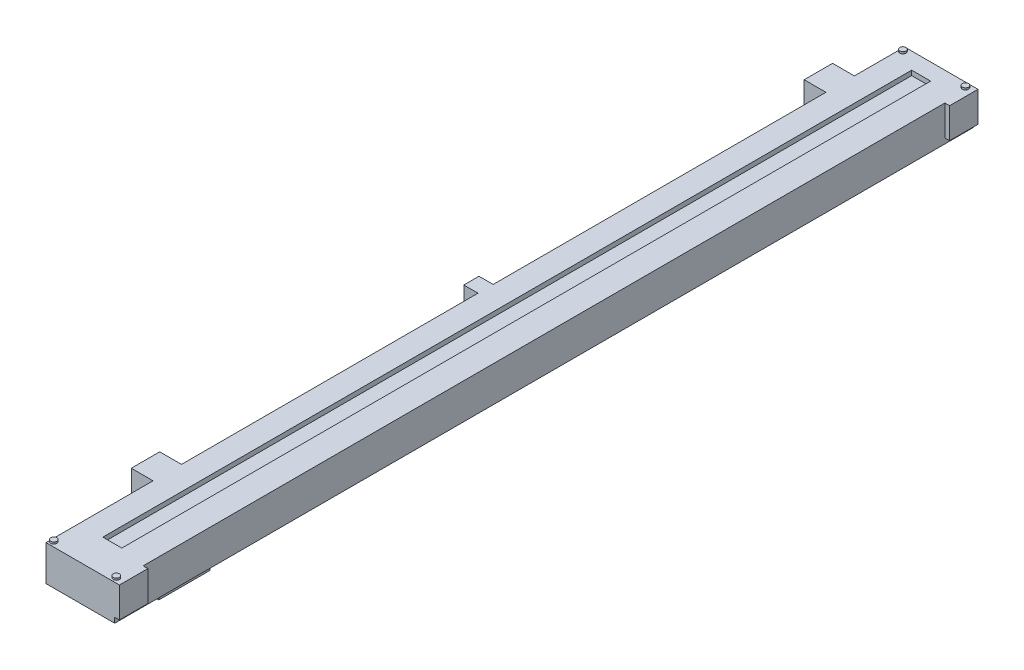
ISO-10303-21;
HEADER;
FILE_DESCRIPTION(('STEP AP214'),'2;1');
FILE_NAME('part.step','',(''),(''),'','','');
FILE_SCHEMA(('AUTOMOTIVE_DESIGN { 1 0 10303 214 1 1 1 1 }'));
ENDSEC;
DATA;
#1=APPLICATION_CONTEXT('core data for automotive mechanical design processes');
#2=APPLICATION_PROTOCOL_DEFINITION('international standard','automotive_design',2000,#1);
#3=PRODUCT_CONTEXT('',#1,'mechanical');
#4=PRODUCT('Part','Part','',(#3));
#5=PRODUCT_RELATED_PRODUCT_CATEGORY('part','',(#4));
#6=PRODUCT_DEFINITION_FORMATION('','',#4);
#7=PRODUCT_DEFINITION_CONTEXT('part definition',#1,'design');
#8=PRODUCT_DEFINITION('design','',#6,#7);
#9=PRODUCT_DEFINITION_SHAPE('','',#8);
#10=(LENGTH_UNIT() NAMED_UNIT(*) SI_UNIT(.MILLI.,.METRE.));
#11=(NAMED_UNIT(*) PLANE_ANGLE_UNIT() SI_UNIT($,.RADIAN.));
#12=(NAMED_UNIT(*) SI_UNIT($,.STERADIAN.) SOLID_ANGLE_UNIT());
#13=UNCERTAINTY_MEASURE_WITH_UNIT(LENGTH_MEASURE(1.E-05),#10,'distance_accuracy_value','');
#14=(GEOMETRIC_REPRESENTATION_CONTEXT(3) GLOBAL_UNCERTAINTY_ASSIGNED_CONTEXT((#13)) GLOBAL_UNIT_ASSIGNED_CONTEXT((#10,
#11,#12)) REPRESENTATION_CONTEXT('',''));
#15=CARTESIAN_POINT('',(0.,0.,0.));
#16=DIRECTION('',(0.,0.,1.));
#17=DIRECTION('',(1.,0.,0.));
#18=AXIS2_PLACEMENT_3D('',#15,#16,#17);
#19=CARTESIAN_POINT('',(0.,0.,0.));
#20=DIRECTION('',(0.,1.,0.));
#21=DIRECTION('',(0.,0.,1.));
#22=AXIS2_PLACEMENT_3D('',#19,#20,#21);
#23=PLANE('',#22);
#24=DIRECTION('',(0.,0.,1.));
#25=VECTOR('',#24,1.);
#26=CARTESIAN_POINT('',(-9.20750000000002,0.,-115.09375));
#27=LINE('',#26,#25);
#28=CARTESIAN_POINT('',(-9.20750000000002,0.,-115.09375));
#29=VERTEX_POINT('',#28);
#30=CARTESIAN_POINT('',(-9.20749999999999,0.,115.09375));
#31=VERTEX_POINT('',#30);
#32=EDGE_CURVE('E374',#29,#31,#27,.T.);
#33=ORIENTED_EDGE('',*,*,#32,.F.);
#34=DIRECTION('',(-1.,0.,0.));
#35=VECTOR('',#34,1.);
#36=CARTESIAN_POINT('',(-9.20750000000002,0.,-115.09375));
#37=LINE('',#36,#35);
#38=CARTESIAN_POINT('',(9.20749999999998,0.,-115.09375));
#39=VERTEX_POINT('',#38);
#40=EDGE_CURVE('E386',#39,#29,#37,.T.);
#41=ORIENTED_EDGE('',*,*,#40,.F.);
#42=DIRECTION('',(0.,0.,-1.));
#43=VECTOR('',#42,1.);
#44=CARTESIAN_POINT('',(9.20749999999998,0.,-115.09375));
#45=LINE('',#44,#43);
#46=CARTESIAN_POINT('',(9.2075,0.,115.09375));
#47=VERTEX_POINT('',#46);
#48=EDGE_CURVE('E382',#47,#39,#45,.T.);
#49=ORIENTED_EDGE('',*,*,#48,.F.);
#50=DIRECTION('',(1.,0.,0.));
#51=VECTOR('',#50,1.);
#52=CARTESIAN_POINT('',(-9.20749999999999,0.,115.09375));
#53=LINE('',#52,#51);
#54=EDGE_CURVE('E378',#31,#47,#53,.T.);
#55=ORIENTED_EDGE('',*,*,#54,.F.);
#56=EDGE_LOOP('',(#33,#41,#49,#55));
#57=FACE_BOUND('',#56,.T.);
#58=DIRECTION('',(0.,0.,1.));
#59=VECTOR('',#58,1.);
#60=CARTESIAN_POINT('',(6.9215,0.,100.97135));
#61=LINE('',#60,#59);
#62=CARTESIAN_POINT('',(6.92150000000001,0.,87.25535));
#63=VERTEX_POINT('',#62);
#64=CARTESIAN_POINT('',(6.9215,0.,100.97135));
#65=VERTEX_POINT('',#64);
#66=EDGE_CURVE('E272',#63,#65,#61,.T.);
#67=ORIENTED_EDGE('',*,*,#66,.F.);
#68=DIRECTION('',(1.,0.,0.));
#69=VECTOR('',#68,1.);
#70=CARTESIAN_POINT('',(6.92150000000001,0.,87.25535));
#71=LINE('',#70,#69);
#72=CARTESIAN_POINT('',(1.84150000000001,0.,87.25535));
#73=VERTEX_POINT('',#72);
#74=EDGE_CURVE('E269',#73,#63,#71,.T.);
#75=ORIENTED_EDGE('',*,*,#74,.F.);
#76=DIRECTION('',(0.,0.,-1.));
#77=VECTOR('',#76,1.);
#78=CARTESIAN_POINT('',(1.8415,0.,100.97135));
#79=LINE('',#78,#77);
#80=CARTESIAN_POINT('',(1.8415,0.,100.97135));
#81=VERTEX_POINT('',#80);
#82=EDGE_CURVE('E61',#81,#73,#79,.T.);
#83=ORIENTED_EDGE('',*,*,#82,.F.);
#84=DIRECTION('',(-1.,0.,0.));
#85=VECTOR('',#84,1.);
#86=CARTESIAN_POINT('',(6.9215,0.,100.97135));
#87=LINE('',#86,#85);
#88=EDGE_CURVE('E56',#65,#81,#87,.T.);
#89=ORIENTED_EDGE('',*,*,#88,.F.);
#90=EDGE_LOOP('',(#67,#75,#83,#89));
#91=FACE_BOUND('',#90,.T.);
#92=ADVANCED_FACE('F38',(#57,#91),#23,.F.);
#93=CARTESIAN_POINT('',(0.,9.525,0.));
#94=DIRECTION('',(0.,1.,0.));
#95=DIRECTION('',(0.,0.,1.));
#96=AXIS2_PLACEMENT_3D('',#93,#94,#95);
#97=PLANE('',#96);
#98=CARTESIAN_POINT('',(8.38200000000003,9.525,113.82375));
#99=DIRECTION('',(0.,1.,0.));
#100=DIRECTION('',(0.,0.,1.));
#101=AXIS2_PLACEMENT_3D('',#98,#99,#100);
#102=CIRCLE('',#101,0.825500000000003);
#103=CARTESIAN_POINT('',(8.38200000000003,9.525,114.64925));
#104=VERTEX_POINT('',#103);
#105=EDGE_CURVE('E282',#104,#104,#102,.T.);
#106=ORIENTED_EDGE('',*,*,#105,.F.);
#107=EDGE_LOOP('',(#106));
#108=FACE_BOUND('',#107,.T.);
#109=DIRECTION('',(0.,0.,1.));
#110=VECTOR('',#109,1.);
#111=CARTESIAN_POINT('',(-2.85750000000002,9.525,-110.64875));
#112=LINE('',#111,#110);
#113=CARTESIAN_POINT('',(-2.85750000000002,9.525,-110.64875));
#114=VERTEX_POINT('',#113);
#115=CARTESIAN_POINT('',(-2.8575,9.525,106.20375));
#116=VERTEX_POINT('',#115);
#117=EDGE_CURVE('E503',#114,#116,#112,.T.);
#118=ORIENTED_EDGE('',*,*,#117,.F.);
#119=DIRECTION('',(-1.,0.,0.));
#120=VECTOR('',#119,1.);
#121=CARTESIAN_POINT('',(-2.85750000000002,9.525,-110.64875));
#122=LINE('',#121,#120);
#123=CARTESIAN_POINT('',(2.22249999999998,9.525,-110.64875));
#124=VERTEX_POINT('',#123);
#125=EDGE_CURVE('E521',#124,#114,#122,.T.);
#126=ORIENTED_EDGE('',*,*,#125,.F.);
#127=DIRECTION('',(0.,0.,-1.));
#128=VECTOR('',#127,1.);
#129=CARTESIAN_POINT('',(2.22249999999998,9.525,-110.64875));
#130=LINE('',#129,#128);
#131=CARTESIAN_POINT('',(2.22250000000001,9.525,106.20375));
#132=VERTEX_POINT('',#131);
#133=EDGE_CURVE('E536',#132,#124,#130,.T.);
#134=ORIENTED_EDGE('',*,*,#133,.F.);
#135=DIRECTION('',(1.,0.,0.));
#136=VECTOR('',#135,1.);
#137=CARTESIAN_POINT('',(-2.8575,9.525,106.20375));
#138=LINE('',#137,#136);
#139=EDGE_CURVE('E533',#116,#132,#138,.T.);
#140=ORIENTED_EDGE('',*,*,#139,.F.);
#141=EDGE_LOOP('',(#118,#126,#134,#140));
#142=FACE_BOUND('',#141,.T.);
#143=CARTESIAN_POINT('',(8.382,9.525,-113.82375));
#144=DIRECTION('',(0.,1.,0.));
#145=DIRECTION('',(0.,0.,1.));
#146=AXIS2_PLACEMENT_3D('',#143,#144,#145);
#147=CIRCLE('',#146,0.825500000000003);
#148=CARTESIAN_POINT('',(8.382,9.525,-112.99825));
#149=VERTEX_POINT('',#148);
#150=EDGE_CURVE('E287',#149,#149,#147,.T.);
#151=ORIENTED_EDGE('',*,*,#150,.F.);
#152=EDGE_LOOP('',(#151));
#153=FACE_BOUND('',#152,.T.);
#154=DIRECTION('',(0.,0.,1.));
#155=VECTOR('',#154,1.);
#156=CARTESIAN_POINT('',(-9.20750000000002,9.525,-115.09375));
#157=LINE('',#156,#155);
#158=CARTESIAN_POINT('',(-9.2075,9.525,86.39175));
#159=VERTEX_POINT('',#158);
#160=CARTESIAN_POINT('',(-9.20749999999999,9.525,113.82375));
#161=VERTEX_POINT('',#160);
#162=EDGE_CURVE('E395',#159,#161,#157,.T.);
#163=ORIENTED_EDGE('',*,*,#162,.T.);
#164=CARTESIAN_POINT('',(-8.38199999999999,9.525,113.82375));
#165=DIRECTION('',(0.,1.,0.));
#166=DIRECTION('',(0.,0.,1.));
#167=AXIS2_PLACEMENT_3D('',#164,#165,#166);
#168=CIRCLE('',#167,0.825500000000006);
#169=EDGE_CURVE('E273',#161,#161,#168,.T.);
#170=ORIENTED_EDGE('',*,*,#169,.F.);
#171=CARTESIAN_POINT('',(-9.20749999999999,9.525,115.09375));
#172=VERTEX_POINT('',#171);
#173=EDGE_CURVE('E42',#161,#172,#157,.T.);
#174=ORIENTED_EDGE('',*,*,#173,.T.);
#175=DIRECTION('',(1.,0.,0.));
#176=VECTOR('',#175,1.);
#177=CARTESIAN_POINT('',(-9.20749999999999,9.525,115.09375));
#178=LINE('',#177,#176);
#179=CARTESIAN_POINT('',(10.4775,9.525,115.09375));
#180=VERTEX_POINT('',#179);
#181=EDGE_CURVE('E367',#172,#180,#178,.T.);
#182=ORIENTED_EDGE('',*,*,#181,.T.);
#183=DIRECTION('',(0.,0.,-1.));
#184=VECTOR('',#183,1.);
#185=CARTESIAN_POINT('',(10.4775,9.525,115.09375));
#186=LINE('',#185,#184);
#187=CARTESIAN_POINT('',(10.4775,9.525,107.47375));
#188=VERTEX_POINT('',#187);
#189=EDGE_CURVE('E299',#180,#188,#186,.T.);
#190=ORIENTED_EDGE('',*,*,#189,.T.);
#191=DIRECTION('',(-1.,0.,0.));
#192=VECTOR('',#191,1.);
#193=CARTESIAN_POINT('',(9.2075,9.525,107.47375));
#194=LINE('',#193,#192);
#195=CARTESIAN_POINT('',(9.2075,9.525,107.47375));
#196=VERTEX_POINT('',#195);
#197=EDGE_CURVE('E306',#188,#196,#194,.T.);
#198=ORIENTED_EDGE('',*,*,#197,.T.);
#199=DIRECTION('',(0.,0.,-1.));
#200=VECTOR('',#199,1.);
#201=CARTESIAN_POINT('',(9.20749999999998,9.525,-115.09375));
#202=LINE('',#201,#200);
#203=CARTESIAN_POINT('',(9.20749999999998,9.525,-107.47375));
#204=VERTEX_POINT('',#203);
#205=EDGE_CURVE('E363',#196,#204,#202,.T.);
#206=ORIENTED_EDGE('',*,*,#205,.T.);
#207=DIRECTION('',(1.,0.,0.));
#208=VECTOR('',#207,1.);
#209=CARTESIAN_POINT('',(9.20749999999998,9.525,-107.47375));
#210=LINE('',#209,#208);
#211=CARTESIAN_POINT('',(10.4775,9.525,-107.47375));
#212=VERTEX_POINT('',#211);
#213=EDGE_CURVE('E322',#204,#212,#210,.T.);
#214=ORIENTED_EDGE('',*,*,#213,.T.);
#215=DIRECTION('',(0.,0.,-1.));
#216=VECTOR('',#215,1.);
#217=CARTESIAN_POINT('',(10.4775,9.525,-115.09375));
#218=LINE('',#217,#216);
#219=CARTESIAN_POINT('',(10.4775,9.525,-115.09375));
#220=VERTEX_POINT('',#219);
#221=EDGE_CURVE('E335',#212,#220,#218,.T.);
#222=ORIENTED_EDGE('',*,*,#221,.T.);
#223=DIRECTION('',(-1.,0.,0.));
#224=VECTOR('',#223,1.);
#225=CARTESIAN_POINT('',(-9.20750000000002,9.525,-115.09375));
#226=LINE('',#225,#224);
#227=CARTESIAN_POINT('',(-9.20750000000002,9.525,-115.09375));
#228=VERTEX_POINT('',#227);
#229=EDGE_CURVE('E366',#220,#228,#226,.T.);
#230=ORIENTED_EDGE('',*,*,#229,.T.);
#231=CARTESIAN_POINT('',(-9.20750000000003,9.525,-113.82375));
#232=VERTEX_POINT('',#231);
#233=EDGE_CURVE('E471',#228,#232,#157,.T.);
#234=ORIENTED_EDGE('',*,*,#233,.T.);
#235=CARTESIAN_POINT('',(-8.38200000000002,9.525,-113.82375));
#236=DIRECTION('',(0.,1.,0.));
#237=DIRECTION('',(0.,0.,1.));
#238=AXIS2_PLACEMENT_3D('',#235,#236,#237);
#239=CIRCLE('',#238,0.825500000000007);
#240=EDGE_CURVE('E293',#232,#232,#239,.T.);
#241=ORIENTED_EDGE('',*,*,#240,.F.);
#242=CARTESIAN_POINT('',(-9.20750000000002,9.525,-101.63175));
#243=VERTEX_POINT('',#242);
#244=EDGE_CURVE('E368',#232,#243,#157,.T.);
#245=ORIENTED_EDGE('',*,*,#244,.T.);
#246=DIRECTION('',(-1.,0.,0.));
#247=VECTOR('',#246,1.);
#248=CARTESIAN_POINT('',(-9.20750000000002,9.525,-101.63175));
#249=LINE('',#248,#247);
#250=CARTESIAN_POINT('',(-15.0495,9.525,-101.63175));
#251=VERTEX_POINT('',#250);
#252=EDGE_CURVE('E678',#243,#251,#249,.T.);
#253=ORIENTED_EDGE('',*,*,#252,.T.);
#254=DIRECTION('',(0.,0.,1.));
#255=VECTOR('',#254,1.);
#256=CARTESIAN_POINT('',(-15.0495,9.525,-101.63175));
#257=LINE('',#256,#255);
#258=CARTESIAN_POINT('',(-15.0495,9.525,-94.01175));
#259=VERTEX_POINT('',#258);
#260=EDGE_CURVE('E498',#251,#259,#257,.T.);
#261=ORIENTED_EDGE('',*,*,#260,.T.);
#262=DIRECTION('',(1.,0.,0.));
#263=VECTOR('',#262,1.);
#264=CARTESIAN_POINT('',(-9.20750000000002,9.525,-94.01175));
#265=LINE('',#264,#263);
#266=CARTESIAN_POINT('',(-9.20750000000002,9.525,-94.01175));
#267=VERTEX_POINT('',#266);
#268=EDGE_CURVE('E494',#259,#267,#265,.T.);
#269=ORIENTED_EDGE('',*,*,#268,.T.);
#270=CARTESIAN_POINT('',(-9.20750000000002,9.525,-4.79424999999997));
#271=VERTEX_POINT('',#270);
#272=EDGE_CURVE('E476',#267,#271,#157,.T.);
#273=ORIENTED_EDGE('',*,*,#272,.T.);
#274=DIRECTION('',(-1.,0.,0.));
#275=VECTOR('',#274,1.);
#276=CARTESIAN_POINT('',(-9.20750000000002,9.525,-4.79424999999997));
#277=LINE('',#276,#275);
#278=CARTESIAN_POINT('',(-13.0175,9.525,-4.79424999999997));
#279=VERTEX_POINT('',#278);
#280=EDGE_CURVE('E639',#271,#279,#277,.T.);
#281=ORIENTED_EDGE('',*,*,#280,.T.);
#282=DIRECTION('',(0.,0.,1.));
#283=VECTOR('',#282,1.);
#284=CARTESIAN_POINT('',(-13.0175,9.525,-4.79424999999997));
#285=LINE('',#284,#283);
#286=CARTESIAN_POINT('',(-13.0175,9.525,-0.730249999999973));
#287=VERTEX_POINT('',#286);
#288=EDGE_CURVE('E668',#279,#287,#285,.T.);
#289=ORIENTED_EDGE('',*,*,#288,.T.);
#290=DIRECTION('',(1.,0.,0.));
#291=VECTOR('',#290,1.);
#292=CARTESIAN_POINT('',(-9.20750000000002,9.525,-0.730249999999974));
#293=LINE('',#292,#291);
#294=CARTESIAN_POINT('',(-9.20750000000001,9.525,-0.730249999999974));
#295=VERTEX_POINT('',#294);
#296=EDGE_CURVE('E652',#287,#295,#293,.T.);
#297=ORIENTED_EDGE('',*,*,#296,.T.);
#298=CARTESIAN_POINT('',(-9.20750000000002,9.525,78.77175));
#299=VERTEX_POINT('',#298);
#300=EDGE_CURVE('E488',#295,#299,#157,.T.);
#301=ORIENTED_EDGE('',*,*,#300,.T.);
#302=DIRECTION('',(-1.,0.,0.));
#303=VECTOR('',#302,1.);
#304=CARTESIAN_POINT('',(-9.20750000000002,9.525,78.77175));
#305=LINE('',#304,#303);
#306=CARTESIAN_POINT('',(-15.0495,9.525,78.77175));
#307=VERTEX_POINT('',#306);
#308=EDGE_CURVE('E341',#299,#307,#305,.T.);
#309=ORIENTED_EDGE('',*,*,#308,.T.);
#310=DIRECTION('',(0.,0.,1.));
#311=VECTOR('',#310,1.);
#312=CARTESIAN_POINT('',(-15.0495,9.525,78.77175));
#313=LINE('',#312,#311);
#314=CARTESIAN_POINT('',(-15.0495,9.525,86.39175));
#315=VERTEX_POINT('',#314);
#316=EDGE_CURVE('E631',#307,#315,#313,.T.);
#317=ORIENTED_EDGE('',*,*,#316,.T.);
#318=DIRECTION('',(1.,0.,0.));
#319=VECTOR('',#318,1.);
#320=CARTESIAN_POINT('',(-9.20750000000002,9.525,86.39175));
#321=LINE('',#320,#319);
#322=EDGE_CURVE('E623',#315,#159,#321,.T.);
#323=ORIENTED_EDGE('',*,*,#322,.T.);
#324=EDGE_LOOP('',(#163,#170,#174,#182,#190,#198,#206,#214,#222,#230,#234,#241,#245,#253,#261,
#269,#273,#281,#289,#297,#301,#309,#317,#323));
#325=FACE_BOUND('',#324,.T.);
#326=ADVANCED_FACE('F401',(#108,#142,#153,#325),#97,.T.);
#327=CARTESIAN_POINT('',(-9.20750000000002,9.525,-115.09375));
#328=DIRECTION('',(1.,0.,0.));
#329=DIRECTION('',(0.,0.,-1.));
#330=AXIS2_PLACEMENT_3D('',#327,#328,#329);
#331=PLANE('',#330);
#332=ORIENTED_EDGE('',*,*,#162,.F.);
#333=DIRECTION('',(0.,1.,0.));
#334=VECTOR('',#333,1.);
#335=CARTESIAN_POINT('',(-9.20750000000002,1.397,86.39175));
#336=LINE('',#335,#334);
#337=CARTESIAN_POINT('',(-9.20750000000002,1.397,86.39175));
#338=VERTEX_POINT('',#337);
#339=EDGE_CURVE('E628',#338,#159,#336,.T.);
#340=ORIENTED_EDGE('',*,*,#339,.F.);
#341=DIRECTION('',(0.,0.,-1.));
#342=VECTOR('',#341,1.);
#343=CARTESIAN_POINT('',(-9.20750000000002,1.397,78.77175));
#344=LINE('',#343,#342);
#345=CARTESIAN_POINT('',(-9.20750000000002,1.397,78.77175));
#346=VERTEX_POINT('',#345);
#347=EDGE_CURVE('E347',#338,#346,#344,.T.);
#348=ORIENTED_EDGE('',*,*,#347,.T.);
#349=DIRECTION('',(0.,1.,0.));
#350=VECTOR('',#349,1.);
#351=CARTESIAN_POINT('',(-9.20750000000002,1.397,78.77175));
#352=LINE('',#351,#350);
#353=EDGE_CURVE('E643',#346,#299,#352,.T.);
#354=ORIENTED_EDGE('',*,*,#353,.T.);
#355=ORIENTED_EDGE('',*,*,#300,.F.);
#356=DIRECTION('',(0.,1.,0.));
#357=VECTOR('',#356,1.);
#358=CARTESIAN_POINT('',(-9.20750000000002,1.397,-0.730249999999974));
#359=LINE('',#358,#357);
#360=CARTESIAN_POINT('',(-9.20750000000002,1.397,-0.730249999999974));
#361=VERTEX_POINT('',#360);
#362=EDGE_CURVE('E674',#361,#295,#359,.T.);
#363=ORIENTED_EDGE('',*,*,#362,.F.);
#364=DIRECTION('',(0.,0.,-1.));
#365=VECTOR('',#364,1.);
#366=CARTESIAN_POINT('',(-9.20750000000002,1.397,-4.79424999999997));
#367=LINE('',#366,#365);
#368=CARTESIAN_POINT('',(-9.20750000000002,1.397,-4.79424999999997));
#369=VERTEX_POINT('',#368);
#370=EDGE_CURVE('E647',#361,#369,#367,.T.);
#371=ORIENTED_EDGE('',*,*,#370,.T.);
#372=DIRECTION('',(0.,1.,0.));
#373=VECTOR('',#372,1.);
#374=CARTESIAN_POINT('',(-9.20750000000002,1.397,-4.79424999999997));
#375=LINE('',#374,#373);
#376=EDGE_CURVE('E664',#369,#271,#375,.T.);
#377=ORIENTED_EDGE('',*,*,#376,.T.);
#378=ORIENTED_EDGE('',*,*,#272,.F.);
#379=DIRECTION('',(0.,1.,0.));
#380=VECTOR('',#379,1.);
#381=CARTESIAN_POINT('',(-9.20750000000002,1.397,-94.01175));
#382=LINE('',#381,#380);
#383=CARTESIAN_POINT('',(-9.20750000000002,1.397,-94.01175));
#384=VERTEX_POINT('',#383);
#385=EDGE_CURVE('E501',#384,#267,#382,.T.);
#386=ORIENTED_EDGE('',*,*,#385,.F.);
#387=DIRECTION('',(0.,0.,-1.));
#388=VECTOR('',#387,1.);
#389=CARTESIAN_POINT('',(-9.20750000000002,1.397,-101.63175));
#390=LINE('',#389,#388);
#391=CARTESIAN_POINT('',(-9.20750000000002,1.397,-101.63175));
#392=VERTEX_POINT('',#391);
#393=EDGE_CURVE('E497',#384,#392,#390,.T.);
#394=ORIENTED_EDGE('',*,*,#393,.T.);
#395=DIRECTION('',(0.,1.,0.));
#396=VECTOR('',#395,1.);
#397=CARTESIAN_POINT('',(-9.20750000000002,1.397,-101.63175));
#398=LINE('',#397,#396);
#399=EDGE_CURVE('E505',#392,#243,#398,.T.);
#400=ORIENTED_EDGE('',*,*,#399,.T.);
#401=ORIENTED_EDGE('',*,*,#244,.F.);
#402=ORIENTED_EDGE('',*,*,#233,.F.);
#403=DIRECTION('',(0.,-1.,0.));
#404=VECTOR('',#403,1.);
#405=CARTESIAN_POINT('',(-9.20750000000002,9.525,-115.09375));
#406=LINE('',#405,#404);
#407=EDGE_CURVE('E373',#228,#29,#406,.T.);
#408=ORIENTED_EDGE('',*,*,#407,.T.);
#409=ORIENTED_EDGE('',*,*,#32,.T.);
#410=DIRECTION('',(0.,-1.,0.));
#411=VECTOR('',#410,1.);
#412=CARTESIAN_POINT('',(-9.20749999999999,9.525,115.09375));
#413=LINE('',#412,#411);
#414=EDGE_CURVE('E11',#172,#31,#413,.T.);
#415=ORIENTED_EDGE('',*,*,#414,.F.);
#416=ORIENTED_EDGE('',*,*,#173,.F.);
#417=EDGE_LOOP('',(#332,#340,#348,#354,#355,#363,#371,#377,#378,#386,#394,#400,#401,#402,#408,
#409,#415,#416));
#418=FACE_BOUND('',#417,.T.);
#419=ADVANCED_FACE('F40',(#418),#331,.F.);
#420=CARTESIAN_POINT('',(-9.20749999999999,9.525,115.09375));
#421=DIRECTION('',(0.,0.,-1.));
#422=DIRECTION('',(-1.,0.,0.));
#423=AXIS2_PLACEMENT_3D('',#420,#421,#422);
#424=PLANE('',#423);
#425=ORIENTED_EDGE('',*,*,#54,.T.);
#426=DIRECTION('',(0.,-1.,0.));
#427=VECTOR('',#426,1.);
#428=CARTESIAN_POINT('',(9.2075,9.525,115.09375));
#429=LINE('',#428,#427);
#430=CARTESIAN_POINT('',(9.2075,1.397,115.09375));
#431=VERTEX_POINT('',#430);
#432=EDGE_CURVE('E48',#431,#47,#429,.T.);
#433=ORIENTED_EDGE('',*,*,#432,.F.);
#434=DIRECTION('',(1.,0.,0.));
#435=VECTOR('',#434,1.);
#436=CARTESIAN_POINT('',(9.2075,1.397,115.09375));
#437=LINE('',#436,#435);
#438=CARTESIAN_POINT('',(10.4775,1.397,115.09375));
#439=VERTEX_POINT('',#438);
#440=EDGE_CURVE('E305',#431,#439,#437,.T.);
#441=ORIENTED_EDGE('',*,*,#440,.T.);
#442=DIRECTION('',(0.,1.,0.));
#443=VECTOR('',#442,1.);
#444=CARTESIAN_POINT('',(10.4775,1.397,115.09375));
#445=LINE('',#444,#443);
#446=EDGE_CURVE('E315',#439,#180,#445,.T.);
#447=ORIENTED_EDGE('',*,*,#446,.T.);
#448=ORIENTED_EDGE('',*,*,#181,.F.);
#449=ORIENTED_EDGE('',*,*,#414,.T.);
#450=EDGE_LOOP('',(#425,#433,#441,#447,#448,#449));
#451=FACE_BOUND('',#450,.T.);
#452=ADVANCED_FACE('F447',(#451),#424,.F.);
#453=CARTESIAN_POINT('',(9.20749999999998,9.525,-115.09375));
#454=DIRECTION('',(-1.,0.,0.));
#455=DIRECTION('',(0.,0.,1.));
#456=AXIS2_PLACEMENT_3D('',#453,#454,#455);
#457=PLANE('',#456);
#458=ORIENTED_EDGE('',*,*,#205,.F.);
#459=DIRECTION('',(0.,1.,0.));
#460=VECTOR('',#459,1.);
#461=CARTESIAN_POINT('',(9.2075,1.397,107.47375));
#462=LINE('',#461,#460);
#463=CARTESIAN_POINT('',(9.2075,1.397,107.47375));
#464=VERTEX_POINT('',#463);
#465=EDGE_CURVE('E319',#464,#196,#462,.T.);
#466=ORIENTED_EDGE('',*,*,#465,.F.);
#467=DIRECTION('',(0.,0.,1.));
#468=VECTOR('',#467,1.);
#469=CARTESIAN_POINT('',(9.2075,1.397,115.09375));
#470=LINE('',#469,#468);
#471=EDGE_CURVE('E302',#464,#431,#470,.T.);
#472=ORIENTED_EDGE('',*,*,#471,.T.);
#473=ORIENTED_EDGE('',*,*,#432,.T.);
#474=ORIENTED_EDGE('',*,*,#48,.T.);
#475=DIRECTION('',(0.,-1.,0.));
#476=VECTOR('',#475,1.);
#477=CARTESIAN_POINT('',(9.20749999999998,9.525,-115.09375));
#478=LINE('',#477,#476);
#479=CARTESIAN_POINT('',(9.20749999999998,1.397,-115.09375));
#480=VERTEX_POINT('',#479);
#481=EDGE_CURVE('E390',#480,#39,#478,.T.);
#482=ORIENTED_EDGE('',*,*,#481,.F.);
#483=DIRECTION('',(0.,0.,1.));
#484=VECTOR('',#483,1.);
#485=CARTESIAN_POINT('',(9.20749999999998,1.397,-115.09375));
#486=LINE('',#485,#484);
#487=CARTESIAN_POINT('',(9.20749999999998,1.397,-107.47375));
#488=VERTEX_POINT('',#487);
#489=EDGE_CURVE('E331',#480,#488,#486,.T.);
#490=ORIENTED_EDGE('',*,*,#489,.T.);
#491=DIRECTION('',(0.,1.,0.));
#492=VECTOR('',#491,1.);
#493=CARTESIAN_POINT('',(9.20749999999998,1.397,-107.47375));
#494=LINE('',#493,#492);
#495=EDGE_CURVE('E344',#488,#204,#494,.T.);
#496=ORIENTED_EDGE('',*,*,#495,.T.);
#497=EDGE_LOOP('',(#458,#466,#472,#473,#474,#482,#490,#496));
#498=FACE_BOUND('',#497,.T.);
#499=ADVANCED_FACE('F408',(#498),#457,.F.);
#500=CARTESIAN_POINT('',(-9.20750000000002,9.525,-115.09375));
#501=DIRECTION('',(0.,0.,1.));
#502=DIRECTION('',(1.,0.,0.));
#503=AXIS2_PLACEMENT_3D('',#500,#501,#502);
#504=PLANE('',#503);
#505=ORIENTED_EDGE('',*,*,#40,.T.);
#506=ORIENTED_EDGE('',*,*,#407,.F.);
#507=ORIENTED_EDGE('',*,*,#229,.F.);
#508=DIRECTION('',(0.,1.,0.));
#509=VECTOR('',#508,1.);
#510=CARTESIAN_POINT('',(10.4775,1.397,-115.09375));
#511=LINE('',#510,#509);
#512=CARTESIAN_POINT('',(10.4775,1.397,-115.09375));
#513=VERTEX_POINT('',#512);
#514=EDGE_CURVE('E338',#513,#220,#511,.T.);
#515=ORIENTED_EDGE('',*,*,#514,.F.);
#516=DIRECTION('',(-1.,0.,0.));
#517=VECTOR('',#516,1.);
#518=CARTESIAN_POINT('',(9.20749999999998,1.397,-115.09375));
#519=LINE('',#518,#517);
#520=EDGE_CURVE('E334',#513,#480,#519,.T.);
#521=ORIENTED_EDGE('',*,*,#520,.T.);
#522=ORIENTED_EDGE('',*,*,#481,.T.);
#523=EDGE_LOOP('',(#505,#506,#507,#515,#521,#522));
#524=FACE_BOUND('',#523,.T.);
#525=ADVANCED_FACE('F416',(#524),#504,.F.);
#526=CARTESIAN_POINT('',(-2.85750000000002,8.255,-110.64875));
#527=DIRECTION('',(-1.,0.,0.));
#528=DIRECTION('',(0.,0.,1.));
#529=AXIS2_PLACEMENT_3D('',#526,#527,#528);
#530=PLANE('',#529);
#531=ORIENTED_EDGE('',*,*,#117,.T.);
#532=DIRECTION('',(0.,1.,0.));
#533=VECTOR('',#532,1.);
#534=CARTESIAN_POINT('',(-2.8575,8.255,106.20375));
#535=LINE('',#534,#533);
#536=CARTESIAN_POINT('',(-2.8575,8.255,106.20375));
#537=VERTEX_POINT('',#536);
#538=EDGE_CURVE('E481',#537,#116,#535,.T.);
#539=ORIENTED_EDGE('',*,*,#538,.F.);
#540=DIRECTION('',(0.,0.,1.));
#541=VECTOR('',#540,1.);
#542=CARTESIAN_POINT('',(-2.85750000000002,8.255,-110.64875));
#543=LINE('',#542,#541);
#544=CARTESIAN_POINT('',(-2.85750000000002,8.255,-110.64875));
#545=VERTEX_POINT('',#544);
#546=EDGE_CURVE('E516',#545,#537,#543,.T.);
#547=ORIENTED_EDGE('',*,*,#546,.F.);
#548=DIRECTION('',(0.,1.,0.));
#549=VECTOR('',#548,1.);
#550=CARTESIAN_POINT('',(-2.85750000000002,8.255,-110.64875));
#551=LINE('',#550,#549);
#552=EDGE_CURVE('E379',#545,#114,#551,.T.);
#553=ORIENTED_EDGE('',*,*,#552,.T.);
#554=EDGE_LOOP('',(#531,#539,#547,#553));
#555=FACE_BOUND('',#554,.T.);
#556=ADVANCED_FACE('F445',(#555),#530,.F.);
#557=CARTESIAN_POINT('',(-2.85750000000002,8.255,-110.64875));
#558=DIRECTION('',(0.,0.,-1.));
#559=DIRECTION('',(-1.,0.,0.));
#560=AXIS2_PLACEMENT_3D('',#557,#558,#559);
#561=PLANE('',#560);
#562=ORIENTED_EDGE('',*,*,#125,.T.);
#563=ORIENTED_EDGE('',*,*,#552,.F.);
#564=DIRECTION('',(-1.,0.,0.));
#565=VECTOR('',#564,1.);
#566=CARTESIAN_POINT('',(-2.85750000000002,8.255,-110.64875));
#567=LINE('',#566,#565);
#568=CARTESIAN_POINT('',(2.22249999999998,8.255,-110.64875));
#569=VERTEX_POINT('',#568);
#570=EDGE_CURVE('E528',#569,#545,#567,.T.);
#571=ORIENTED_EDGE('',*,*,#570,.F.);
#572=DIRECTION('',(0.,1.,0.));
#573=VECTOR('',#572,1.);
#574=CARTESIAN_POINT('',(2.22249999999998,8.255,-110.64875));
#575=LINE('',#574,#573);
#576=EDGE_CURVE('E543',#569,#124,#575,.T.);
#577=ORIENTED_EDGE('',*,*,#576,.T.);
#578=EDGE_LOOP('',(#562,#563,#571,#577));
#579=FACE_BOUND('',#578,.T.);
#580=ADVANCED_FACE('F564',(#579),#561,.F.);
#581=CARTESIAN_POINT('',(2.22249999999998,8.255,-110.64875));
#582=DIRECTION('',(1.,0.,0.));
#583=DIRECTION('',(0.,0.,-1.));
#584=AXIS2_PLACEMENT_3D('',#581,#582,#583);
#585=PLANE('',#584);
#586=ORIENTED_EDGE('',*,*,#133,.T.);
#587=ORIENTED_EDGE('',*,*,#576,.F.);
#588=DIRECTION('',(0.,0.,-1.));
#589=VECTOR('',#588,1.);
#590=CARTESIAN_POINT('',(2.22249999999998,8.255,-110.64875));
#591=LINE('',#590,#589);
#592=CARTESIAN_POINT('',(2.22250000000001,8.255,106.20375));
#593=VERTEX_POINT('',#592);
#594=EDGE_CURVE('E524',#593,#569,#591,.T.);
#595=ORIENTED_EDGE('',*,*,#594,.F.);
#596=DIRECTION('',(0.,1.,0.));
#597=VECTOR('',#596,1.);
#598=CARTESIAN_POINT('',(2.22250000000001,8.255,106.20375));
#599=LINE('',#598,#597);
#600=EDGE_CURVE('E544',#593,#132,#599,.T.);
#601=ORIENTED_EDGE('',*,*,#600,.T.);
#602=EDGE_LOOP('',(#586,#587,#595,#601));
#603=FACE_BOUND('',#602,.T.);
#604=ADVANCED_FACE('F559',(#603),#585,.F.);
#605=CARTESIAN_POINT('',(-2.8575,8.255,106.20375));
#606=DIRECTION('',(0.,0.,1.));
#607=DIRECTION('',(1.,0.,0.));
#608=AXIS2_PLACEMENT_3D('',#605,#606,#607);
#609=PLANE('',#608);
#610=ORIENTED_EDGE('',*,*,#139,.T.);
#611=ORIENTED_EDGE('',*,*,#600,.F.);
#612=DIRECTION('',(1.,0.,0.));
#613=VECTOR('',#612,1.);
#614=CARTESIAN_POINT('',(-2.8575,8.255,106.20375));
#615=LINE('',#614,#613);
#616=EDGE_CURVE('E520',#537,#593,#615,.T.);
#617=ORIENTED_EDGE('',*,*,#616,.F.);
#618=ORIENTED_EDGE('',*,*,#538,.T.);
#619=EDGE_LOOP('',(#610,#611,#617,#618));
#620=FACE_BOUND('',#619,.T.);
#621=ADVANCED_FACE('F551',(#620),#609,.F.);
#622=CARTESIAN_POINT('',(0.,8.255,0.));
#623=DIRECTION('',(0.,1.,0.));
#624=DIRECTION('',(0.,0.,1.));
#625=AXIS2_PLACEMENT_3D('',#622,#623,#624);
#626=PLANE('',#625);
#627=ORIENTED_EDGE('',*,*,#546,.T.);
#628=ORIENTED_EDGE('',*,*,#616,.T.);
#629=ORIENTED_EDGE('',*,*,#594,.T.);
#630=ORIENTED_EDGE('',*,*,#570,.T.);
#631=EDGE_LOOP('',(#627,#628,#629,#630));
#632=FACE_BOUND('',#631,.T.);
#633=ADVANCED_FACE('F563',(#632),#626,.T.);
#634=CARTESIAN_POINT('',(-9.20750000000002,1.397,-94.01175));
#635=DIRECTION('',(0.,0.,1.));
#636=DIRECTION('',(1.,0.,0.));
#637=AXIS2_PLACEMENT_3D('',#634,#635,#636);
#638=PLANE('',#637);
#639=ORIENTED_EDGE('',*,*,#268,.F.);
#640=DIRECTION('',(0.,1.,0.));
#641=VECTOR('',#640,1.);
#642=CARTESIAN_POINT('',(-15.0495,1.397,-94.01175));
#643=LINE('',#642,#641);
#644=CARTESIAN_POINT('',(-15.0495,1.397,-94.01175));
#645=VERTEX_POINT('',#644);
#646=EDGE_CURVE('E504',#645,#259,#643,.T.);
#647=ORIENTED_EDGE('',*,*,#646,.F.);
#648=DIRECTION('',(1.,0.,0.));
#649=VECTOR('',#648,1.);
#650=CARTESIAN_POINT('',(-9.20750000000002,1.397,-94.01175));
#651=LINE('',#650,#649);
#652=EDGE_CURVE('E510',#645,#384,#651,.T.);
#653=ORIENTED_EDGE('',*,*,#652,.T.);
#654=ORIENTED_EDGE('',*,*,#385,.T.);
#655=EDGE_LOOP('',(#639,#647,#653,#654));
#656=FACE_BOUND('',#655,.T.);
#657=ADVANCED_FACE('F577',(#656),#638,.T.);
#658=CARTESIAN_POINT('',(-15.0495,1.397,-101.63175));
#659=DIRECTION('',(-1.,0.,0.));
#660=DIRECTION('',(0.,0.,1.));
#661=AXIS2_PLACEMENT_3D('',#658,#659,#660);
#662=PLANE('',#661);
#663=ORIENTED_EDGE('',*,*,#260,.F.);
#664=DIRECTION('',(0.,1.,0.));
#665=VECTOR('',#664,1.);
#666=CARTESIAN_POINT('',(-15.0495,1.397,-101.63175));
#667=LINE('',#666,#665);
#668=CARTESIAN_POINT('',(-15.0495,1.397,-101.63175));
#669=VERTEX_POINT('',#668);
#670=EDGE_CURVE('E509',#669,#251,#667,.T.);
#671=ORIENTED_EDGE('',*,*,#670,.F.);
#672=DIRECTION('',(0.,0.,1.));
#673=VECTOR('',#672,1.);
#674=CARTESIAN_POINT('',(-15.0495,1.397,-101.63175));
#675=LINE('',#674,#673);
#676=EDGE_CURVE('E693',#669,#645,#675,.T.);
#677=ORIENTED_EDGE('',*,*,#676,.T.);
#678=ORIENTED_EDGE('',*,*,#646,.T.);
#679=EDGE_LOOP('',(#663,#671,#677,#678));
#680=FACE_BOUND('',#679,.T.);
#681=ADVANCED_FACE('F582',(#680),#662,.T.);
#682=CARTESIAN_POINT('',(-9.20750000000002,1.397,-101.63175));
#683=DIRECTION('',(0.,0.,-1.));
#684=DIRECTION('',(-1.,0.,0.));
#685=AXIS2_PLACEMENT_3D('',#682,#683,#684);
#686=PLANE('',#685);
#687=ORIENTED_EDGE('',*,*,#252,.F.);
#688=ORIENTED_EDGE('',*,*,#399,.F.);
#689=DIRECTION('',(-1.,0.,0.));
#690=VECTOR('',#689,1.);
#691=CARTESIAN_POINT('',(-9.20750000000002,1.397,-101.63175));
#692=LINE('',#691,#690);
#693=EDGE_CURVE('E690',#392,#669,#692,.T.);
#694=ORIENTED_EDGE('',*,*,#693,.T.);
#695=ORIENTED_EDGE('',*,*,#670,.T.);
#696=EDGE_LOOP('',(#687,#688,#694,#695));
#697=FACE_BOUND('',#696,.T.);
#698=ADVANCED_FACE('F578',(#697),#686,.T.);
#699=CARTESIAN_POINT('',(0.,1.397,0.));
#700=DIRECTION('',(0.,-1.,0.));
#701=DIRECTION('',(0.,0.,-1.));
#702=AXIS2_PLACEMENT_3D('',#699,#700,#701);
#703=PLANE('',#702);
#704=ORIENTED_EDGE('',*,*,#393,.F.);
#705=ORIENTED_EDGE('',*,*,#652,.F.);
#706=ORIENTED_EDGE('',*,*,#676,.F.);
#707=ORIENTED_EDGE('',*,*,#693,.F.);
#708=EDGE_LOOP('',(#704,#705,#706,#707));
#709=FACE_BOUND('',#708,.T.);
#710=ADVANCED_FACE('F581',(#709),#703,.T.);
#711=CARTESIAN_POINT('',(-9.20750000000002,1.397,-0.730249999999974));
#712=DIRECTION('',(0.,0.,1.));
#713=DIRECTION('',(1.,0.,0.));
#714=AXIS2_PLACEMENT_3D('',#711,#712,#713);
#715=PLANE('',#714);
#716=ORIENTED_EDGE('',*,*,#296,.F.);
#717=DIRECTION('',(0.,1.,0.));
#718=VECTOR('',#717,1.);
#719=CARTESIAN_POINT('',(-13.0175,1.397,-0.730249999999973));
#720=LINE('',#719,#718);
#721=CARTESIAN_POINT('',(-13.0175,1.397,-0.730249999999973));
#722=VERTEX_POINT('',#721);
#723=EDGE_CURVE('E679',#722,#287,#720,.T.);
#724=ORIENTED_EDGE('',*,*,#723,.F.);
#725=DIRECTION('',(1.,0.,0.));
#726=VECTOR('',#725,1.);
#727=CARTESIAN_POINT('',(-9.20750000000002,1.397,-0.730249999999974));
#728=LINE('',#727,#726);
#729=EDGE_CURVE('E660',#722,#361,#728,.T.);
#730=ORIENTED_EDGE('',*,*,#729,.T.);
#731=ORIENTED_EDGE('',*,*,#362,.T.);
#732=EDGE_LOOP('',(#716,#724,#730,#731));
#733=FACE_BOUND('',#732,.T.);
#734=ADVANCED_FACE('F592',(#733),#715,.T.);
#735=CARTESIAN_POINT('',(-13.0175,1.397,-4.79424999999997));
#736=DIRECTION('',(-1.,0.,0.));
#737=DIRECTION('',(0.,0.,1.));
#738=AXIS2_PLACEMENT_3D('',#735,#736,#737);
#739=PLANE('',#738);
#740=ORIENTED_EDGE('',*,*,#288,.F.);
#741=DIRECTION('',(0.,1.,0.));
#742=VECTOR('',#741,1.);
#743=CARTESIAN_POINT('',(-13.0175,1.397,-4.79424999999997));
#744=LINE('',#743,#742);
#745=CARTESIAN_POINT('',(-13.0175,1.397,-4.79424999999997));
#746=VERTEX_POINT('',#745);
#747=EDGE_CURVE('E682',#746,#279,#744,.T.);
#748=ORIENTED_EDGE('',*,*,#747,.F.);
#749=DIRECTION('',(0.,0.,1.));
#750=VECTOR('',#749,1.);
#751=CARTESIAN_POINT('',(-13.0175,1.397,-4.79424999999997));
#752=LINE('',#751,#750);
#753=EDGE_CURVE('E656',#746,#722,#752,.T.);
#754=ORIENTED_EDGE('',*,*,#753,.T.);
#755=ORIENTED_EDGE('',*,*,#723,.T.);
#756=EDGE_LOOP('',(#740,#748,#754,#755));
#757=FACE_BOUND('',#756,.T.);
#758=ADVANCED_FACE('F598',(#757),#739,.T.);
#759=CARTESIAN_POINT('',(-9.20750000000002,1.397,-4.79424999999997));
#760=DIRECTION('',(0.,0.,-1.));
#761=DIRECTION('',(-1.,0.,0.));
#762=AXIS2_PLACEMENT_3D('',#759,#760,#761);
#763=PLANE('',#762);
#764=ORIENTED_EDGE('',*,*,#280,.F.);
#765=ORIENTED_EDGE('',*,*,#376,.F.);
#766=DIRECTION('',(-1.,0.,0.));
#767=VECTOR('',#766,1.);
#768=CARTESIAN_POINT('',(-9.20750000000002,1.397,-4.79424999999997));
#769=LINE('',#768,#767);
#770=EDGE_CURVE('E651',#369,#746,#769,.T.);
#771=ORIENTED_EDGE('',*,*,#770,.T.);
#772=ORIENTED_EDGE('',*,*,#747,.T.);
#773=EDGE_LOOP('',(#764,#765,#771,#772));
#774=FACE_BOUND('',#773,.T.);
#775=ADVANCED_FACE('F594',(#774),#763,.T.);
#776=CARTESIAN_POINT('',(0.,1.397,0.));
#777=DIRECTION('',(0.,-1.,0.));
#778=DIRECTION('',(0.,0.,-1.));
#779=AXIS2_PLACEMENT_3D('',#776,#777,#778);
#780=PLANE('',#779);
#781=ORIENTED_EDGE('',*,*,#370,.F.);
#782=ORIENTED_EDGE('',*,*,#729,.F.);
#783=ORIENTED_EDGE('',*,*,#753,.F.);
#784=ORIENTED_EDGE('',*,*,#770,.F.);
#785=EDGE_LOOP('',(#781,#782,#783,#784));
#786=FACE_BOUND('',#785,.T.);
#787=ADVANCED_FACE('F597',(#786),#780,.T.);
#788=CARTESIAN_POINT('',(-9.20750000000002,1.397,86.39175));
#789=DIRECTION('',(0.,0.,1.));
#790=DIRECTION('',(1.,0.,0.));
#791=AXIS2_PLACEMENT_3D('',#788,#789,#790);
#792=PLANE('',#791);
#793=ORIENTED_EDGE('',*,*,#322,.F.);
#794=DIRECTION('',(0.,1.,0.));
#795=VECTOR('',#794,1.);
#796=CARTESIAN_POINT('',(-15.0495,1.397,86.39175));
#797=LINE('',#796,#795);
#798=CARTESIAN_POINT('',(-15.0495,1.397,86.39175));
#799=VERTEX_POINT('',#798);
#800=EDGE_CURVE('E625',#799,#315,#797,.T.);
#801=ORIENTED_EDGE('',*,*,#800,.F.);
#802=DIRECTION('',(1.,0.,0.));
#803=VECTOR('',#802,1.);
#804=CARTESIAN_POINT('',(-9.20750000000002,1.397,86.39175));
#805=LINE('',#804,#803);
#806=EDGE_CURVE('E646',#799,#338,#805,.T.);
#807=ORIENTED_EDGE('',*,*,#806,.T.);
#808=ORIENTED_EDGE('',*,*,#339,.T.);
#809=EDGE_LOOP('',(#793,#801,#807,#808));
#810=FACE_BOUND('',#809,.T.);
#811=ADVANCED_FACE('F608',(#810),#792,.T.);
#812=CARTESIAN_POINT('',(-15.0495,1.397,78.77175));
#813=DIRECTION('',(-1.,0.,0.));
#814=DIRECTION('',(0.,0.,1.));
#815=AXIS2_PLACEMENT_3D('',#812,#813,#814);
#816=PLANE('',#815);
#817=ORIENTED_EDGE('',*,*,#316,.F.);
#818=DIRECTION('',(0.,1.,0.));
#819=VECTOR('',#818,1.);
#820=CARTESIAN_POINT('',(-15.0495,1.397,78.77175));
#821=LINE('',#820,#819);
#822=CARTESIAN_POINT('',(-15.0495,1.397,78.77175));
#823=VERTEX_POINT('',#822);
#824=EDGE_CURVE('E641',#823,#307,#821,.T.);
#825=ORIENTED_EDGE('',*,*,#824,.F.);
#826=DIRECTION('',(0.,0.,1.));
#827=VECTOR('',#826,1.);
#828=CARTESIAN_POINT('',(-15.0495,1.397,78.77175));
#829=LINE('',#828,#827);
#830=EDGE_CURVE('E722',#823,#799,#829,.T.);
#831=ORIENTED_EDGE('',*,*,#830,.T.);
#832=ORIENTED_EDGE('',*,*,#800,.T.);
#833=EDGE_LOOP('',(#817,#825,#831,#832));
#834=FACE_BOUND('',#833,.T.);
#835=ADVANCED_FACE('F612',(#834),#816,.T.);
#836=CARTESIAN_POINT('',(-9.20750000000002,1.397,78.77175));
#837=DIRECTION('',(0.,0.,-1.));
#838=DIRECTION('',(-1.,0.,0.));
#839=AXIS2_PLACEMENT_3D('',#836,#837,#838);
#840=PLANE('',#839);
#841=ORIENTED_EDGE('',*,*,#308,.F.);
#842=ORIENTED_EDGE('',*,*,#353,.F.);
#843=DIRECTION('',(-1.,0.,0.));
#844=VECTOR('',#843,1.);
#845=CARTESIAN_POINT('',(-9.20750000000002,1.397,78.77175));
#846=LINE('',#845,#844);
#847=EDGE_CURVE('E634',#346,#823,#846,.T.);
#848=ORIENTED_EDGE('',*,*,#847,.T.);
#849=ORIENTED_EDGE('',*,*,#824,.T.);
#850=EDGE_LOOP('',(#841,#842,#848,#849));
#851=FACE_BOUND('',#850,.T.);
#852=ADVANCED_FACE('F428',(#851),#840,.T.);
#853=CARTESIAN_POINT('',(0.,1.397,0.));
#854=DIRECTION('',(0.,-1.,0.));
#855=DIRECTION('',(0.,0.,-1.));
#856=AXIS2_PLACEMENT_3D('',#853,#854,#855);
#857=PLANE('',#856);
#858=ORIENTED_EDGE('',*,*,#347,.F.);
#859=ORIENTED_EDGE('',*,*,#806,.F.);
#860=ORIENTED_EDGE('',*,*,#830,.F.);
#861=ORIENTED_EDGE('',*,*,#847,.F.);
#862=EDGE_LOOP('',(#858,#859,#860,#861));
#863=FACE_BOUND('',#862,.T.);
#864=ADVANCED_FACE('F421',(#863),#857,.T.);
#865=CARTESIAN_POINT('',(10.4775,1.397,-115.09375));
#866=DIRECTION('',(1.,0.,0.));
#867=DIRECTION('',(0.,0.,-1.));
#868=AXIS2_PLACEMENT_3D('',#865,#866,#867);
#869=PLANE('',#868);
#870=ORIENTED_EDGE('',*,*,#221,.F.);
#871=DIRECTION('',(0.,1.,0.));
#872=VECTOR('',#871,1.);
#873=CARTESIAN_POINT('',(10.4775,1.397,-107.47375));
#874=LINE('',#873,#872);
#875=CARTESIAN_POINT('',(10.4775,1.397,-107.47375));
#876=VERTEX_POINT('',#875);
#877=EDGE_CURVE('E342',#876,#212,#874,.T.);
#878=ORIENTED_EDGE('',*,*,#877,.F.);
#879=DIRECTION('',(0.,0.,-1.));
#880=VECTOR('',#879,1.);
#881=CARTESIAN_POINT('',(10.4775,1.397,-115.09375));
#882=LINE('',#881,#880);
#883=EDGE_CURVE('E330',#876,#513,#882,.T.);
#884=ORIENTED_EDGE('',*,*,#883,.T.);
#885=ORIENTED_EDGE('',*,*,#514,.T.);
#886=EDGE_LOOP('',(#870,#878,#884,#885));
#887=FACE_BOUND('',#886,.T.);
#888=ADVANCED_FACE('F419',(#887),#869,.T.);
#889=CARTESIAN_POINT('',(9.20749999999998,1.397,-107.47375));
#890=DIRECTION('',(0.,0.,1.));
#891=DIRECTION('',(1.,0.,0.));
#892=AXIS2_PLACEMENT_3D('',#889,#890,#891);
#893=PLANE('',#892);
#894=ORIENTED_EDGE('',*,*,#213,.F.);
#895=ORIENTED_EDGE('',*,*,#495,.F.);
#896=DIRECTION('',(1.,0.,0.));
#897=VECTOR('',#896,1.);
#898=CARTESIAN_POINT('',(9.20749999999998,1.397,-107.47375));
#899=LINE('',#898,#897);
#900=EDGE_CURVE('E327',#488,#876,#899,.T.);
#901=ORIENTED_EDGE('',*,*,#900,.T.);
#902=ORIENTED_EDGE('',*,*,#877,.T.);
#903=EDGE_LOOP('',(#894,#895,#901,#902));
#904=FACE_BOUND('',#903,.T.);
#905=ADVANCED_FACE('F405',(#904),#893,.T.);
#906=CARTESIAN_POINT('',(0.,1.397,0.));
#907=DIRECTION('',(0.,1.,0.));
#908=DIRECTION('',(0.,0.,1.));
#909=AXIS2_PLACEMENT_3D('',#906,#907,#908);
#910=PLANE('',#909);
#911=ORIENTED_EDGE('',*,*,#489,.F.);
#912=ORIENTED_EDGE('',*,*,#520,.F.);
#913=ORIENTED_EDGE('',*,*,#883,.F.);
#914=ORIENTED_EDGE('',*,*,#900,.F.);
#915=EDGE_LOOP('',(#911,#912,#913,#914));
#916=FACE_BOUND('',#915,.T.);
#917=ADVANCED_FACE('F413',(#916),#910,.F.);
#918=CARTESIAN_POINT('',(9.2075,1.397,107.47375));
#919=DIRECTION('',(0.,0.,-1.));
#920=DIRECTION('',(-1.,0.,0.));
#921=AXIS2_PLACEMENT_3D('',#918,#919,#920);
#922=PLANE('',#921);
#923=ORIENTED_EDGE('',*,*,#197,.F.);
#924=DIRECTION('',(0.,1.,0.));
#925=VECTOR('',#924,1.);
#926=CARTESIAN_POINT('',(10.4775,1.397,107.47375));
#927=LINE('',#926,#925);
#928=CARTESIAN_POINT('',(10.4775,1.397,107.47375));
#929=VERTEX_POINT('',#928);
#930=EDGE_CURVE('E323',#929,#188,#927,.T.);
#931=ORIENTED_EDGE('',*,*,#930,.F.);
#932=DIRECTION('',(-1.,0.,0.));
#933=VECTOR('',#932,1.);
#934=CARTESIAN_POINT('',(9.2075,1.397,107.47375));
#935=LINE('',#934,#933);
#936=EDGE_CURVE('E312',#929,#464,#935,.T.);
#937=ORIENTED_EDGE('',*,*,#936,.T.);
#938=ORIENTED_EDGE('',*,*,#465,.T.);
#939=EDGE_LOOP('',(#923,#931,#937,#938));
#940=FACE_BOUND('',#939,.T.);
#941=ADVANCED_FACE('F465',(#940),#922,.T.);
#942=CARTESIAN_POINT('',(10.4775,1.397,115.09375));
#943=DIRECTION('',(1.,0.,0.));
#944=DIRECTION('',(0.,0.,-1.));
#945=AXIS2_PLACEMENT_3D('',#942,#943,#944);
#946=PLANE('',#945);
#947=ORIENTED_EDGE('',*,*,#189,.F.);
#948=ORIENTED_EDGE('',*,*,#446,.F.);
#949=DIRECTION('',(0.,0.,-1.));
#950=VECTOR('',#949,1.);
#951=CARTESIAN_POINT('',(10.4775,1.397,115.09375));
#952=LINE('',#951,#950);
#953=EDGE_CURVE('E309',#439,#929,#952,.T.);
#954=ORIENTED_EDGE('',*,*,#953,.T.);
#955=ORIENTED_EDGE('',*,*,#930,.T.);
#956=EDGE_LOOP('',(#947,#948,#954,#955));
#957=FACE_BOUND('',#956,.T.);
#958=ADVANCED_FACE('F468',(#957),#946,.T.);
#959=CARTESIAN_POINT('',(0.,1.397,0.));
#960=DIRECTION('',(0.,-1.,0.));
#961=DIRECTION('',(0.,0.,-1.));
#962=AXIS2_PLACEMENT_3D('',#959,#960,#961);
#963=PLANE('',#962);
#964=ORIENTED_EDGE('',*,*,#471,.F.);
#965=ORIENTED_EDGE('',*,*,#936,.F.);
#966=ORIENTED_EDGE('',*,*,#953,.F.);
#967=ORIENTED_EDGE('',*,*,#440,.F.);
#968=EDGE_LOOP('',(#964,#965,#966,#967));
#969=FACE_BOUND('',#968,.T.);
#970=ADVANCED_FACE('F461',(#969),#963,.T.);
#971=CARTESIAN_POINT('',(-8.38200000000002,10.033,-113.82375));
#972=DIRECTION('',(0.,-1.,0.));
#973=DIRECTION('',(0.,0.,-1.));
#974=AXIS2_PLACEMENT_3D('',#971,#972,#973);
#975=CYLINDRICAL_SURFACE('',#974,0.825500000000007);
#976=CARTESIAN_POINT('',(-8.38200000000002,10.033,-113.82375));
#977=DIRECTION('',(0.,1.,0.));
#978=DIRECTION('',(0.,0.,1.));
#979=AXIS2_PLACEMENT_3D('',#976,#977,#978);
#980=CIRCLE('',#979,0.825500000000007);
#981=CARTESIAN_POINT('',(-8.38200000000002,10.033,-112.99825));
#982=VERTEX_POINT('',#981);
#983=EDGE_CURVE('E296',#982,#982,#980,.T.);
#984=ORIENTED_EDGE('',*,*,#983,.F.);
#985=EDGE_LOOP('',(#984));
#986=FACE_BOUND('',#985,.T.);
#987=ORIENTED_EDGE('',*,*,#240,.T.);
#988=EDGE_LOOP('',(#987));
#989=FACE_BOUND('',#988,.T.);
#990=ADVANCED_FACE('F758',(#986,#989),#975,.T.);
#991=CARTESIAN_POINT('',(-8.38200000000002,10.033,-113.82375));
#992=DIRECTION('',(0.,1.,0.));
#993=DIRECTION('',(0.,0.,1.));
#994=AXIS2_PLACEMENT_3D('',#991,#992,#993);
#995=PLANE('',#994);
#996=ORIENTED_EDGE('',*,*,#983,.T.);
#997=EDGE_LOOP('',(#996));
#998=FACE_BOUND('',#997,.T.);
#999=ADVANCED_FACE('F754',(#998),#995,.T.);
#1000=CARTESIAN_POINT('',(8.382,10.033,-113.82375));
#1001=DIRECTION('',(0.,-1.,0.));
#1002=DIRECTION('',(0.,0.,-1.));
#1003=AXIS2_PLACEMENT_3D('',#1000,#1001,#1002);
#1004=CYLINDRICAL_SURFACE('',#1003,0.825500000000003);
#1005=CARTESIAN_POINT('',(8.382,10.033,-113.82375));
#1006=DIRECTION('',(0.,1.,0.));
#1007=DIRECTION('',(0.,0.,1.));
#1008=AXIS2_PLACEMENT_3D('',#1005,#1006,#1007);
#1009=CIRCLE('',#1008,0.825500000000003);
#1010=CARTESIAN_POINT('',(8.382,10.033,-112.99825));
#1011=VERTEX_POINT('',#1010);
#1012=EDGE_CURVE('E290',#1011,#1011,#1009,.T.);
#1013=ORIENTED_EDGE('',*,*,#1012,.F.);
#1014=EDGE_LOOP('',(#1013));
#1015=FACE_BOUND('',#1014,.T.);
#1016=ORIENTED_EDGE('',*,*,#150,.T.);
#1017=EDGE_LOOP('',(#1016));
#1018=FACE_BOUND('',#1017,.T.);
#1019=ADVANCED_FACE('F750',(#1015,#1018),#1004,.T.);
#1020=CARTESIAN_POINT('',(8.382,10.033,-113.82375));
#1021=DIRECTION('',(0.,1.,0.));
#1022=DIRECTION('',(0.,0.,1.));
#1023=AXIS2_PLACEMENT_3D('',#1020,#1021,#1022);
#1024=PLANE('',#1023);
#1025=ORIENTED_EDGE('',*,*,#1012,.T.);
#1026=EDGE_LOOP('',(#1025));
#1027=FACE_BOUND('',#1026,.T.);
#1028=ADVANCED_FACE('F746',(#1027),#1024,.T.);
#1029=CARTESIAN_POINT('',(8.38200000000003,10.033,113.82375));
#1030=DIRECTION('',(0.,-1.,0.));
#1031=DIRECTION('',(0.,0.,-1.));
#1032=AXIS2_PLACEMENT_3D('',#1029,#1030,#1031);
#1033=CYLINDRICAL_SURFACE('',#1032,0.825500000000003);
#1034=CARTESIAN_POINT('',(8.38200000000003,10.033,113.82375));
#1035=DIRECTION('',(0.,1.,0.));
#1036=DIRECTION('',(0.,0.,1.));
#1037=AXIS2_PLACEMENT_3D('',#1034,#1035,#1036);
#1038=CIRCLE('',#1037,0.825500000000003);
#1039=CARTESIAN_POINT('',(8.38200000000003,10.033,114.64925));
#1040=VERTEX_POINT('',#1039);
#1041=EDGE_CURVE('E284',#1040,#1040,#1038,.T.);
#1042=ORIENTED_EDGE('',*,*,#1041,.F.);
#1043=EDGE_LOOP('',(#1042));
#1044=FACE_BOUND('',#1043,.T.);
#1045=ORIENTED_EDGE('',*,*,#105,.T.);
#1046=EDGE_LOOP('',(#1045));
#1047=FACE_BOUND('',#1046,.T.);
#1048=ADVANCED_FACE('F738',(#1044,#1047),#1033,.T.);
#1049=CARTESIAN_POINT('',(8.38200000000003,10.033,113.82375));
#1050=DIRECTION('',(0.,1.,0.));
#1051=DIRECTION('',(0.,0.,1.));
#1052=AXIS2_PLACEMENT_3D('',#1049,#1050,#1051);
#1053=PLANE('',#1052);
#1054=ORIENTED_EDGE('',*,*,#1041,.T.);
#1055=EDGE_LOOP('',(#1054));
#1056=FACE_BOUND('',#1055,.T.);
#1057=ADVANCED_FACE('F729',(#1056),#1053,.T.);
#1058=CARTESIAN_POINT('',(-8.38199999999999,10.033,113.82375));
#1059=DIRECTION('',(0.,-1.,0.));
#1060=DIRECTION('',(0.,0.,-1.));
#1061=AXIS2_PLACEMENT_3D('',#1058,#1059,#1060);
#1062=CYLINDRICAL_SURFACE('',#1061,0.825500000000006);
#1063=CARTESIAN_POINT('',(-8.38199999999999,10.033,113.82375));
#1064=DIRECTION('',(0.,1.,0.));
#1065=DIRECTION('',(0.,0.,1.));
#1066=AXIS2_PLACEMENT_3D('',#1063,#1064,#1065);
#1067=CIRCLE('',#1066,0.825500000000006);
#1068=CARTESIAN_POINT('',(-8.38199999999999,10.033,114.64925));
#1069=VERTEX_POINT('',#1068);
#1070=EDGE_CURVE('E275',#1069,#1069,#1067,.T.);
#1071=ORIENTED_EDGE('',*,*,#1070,.F.);
#1072=EDGE_LOOP('',(#1071));
#1073=FACE_BOUND('',#1072,.T.);
#1074=ORIENTED_EDGE('',*,*,#169,.T.);
#1075=EDGE_LOOP('',(#1074));
#1076=FACE_BOUND('',#1075,.T.);
#1077=ADVANCED_FACE('F726',(#1073,#1076),#1062,.T.);
#1078=CARTESIAN_POINT('',(-8.38199999999999,10.033,113.82375));
#1079=DIRECTION('',(0.,1.,0.));
#1080=DIRECTION('',(0.,0.,1.));
#1081=AXIS2_PLACEMENT_3D('',#1078,#1079,#1080);
#1082=PLANE('',#1081);
#1083=ORIENTED_EDGE('',*,*,#1070,.T.);
#1084=EDGE_LOOP('',(#1083));
#1085=FACE_BOUND('',#1084,.T.);
#1086=ADVANCED_FACE('F728',(#1085),#1082,.T.);
#1087=CARTESIAN_POINT('',(6.9215,-2.794,100.97135));
#1088=DIRECTION('',(-1.,0.,0.));
#1089=DIRECTION('',(0.,0.,1.));
#1090=AXIS2_PLACEMENT_3D('',#1087,#1088,#1089);
#1091=PLANE('',#1090);
#1092=ORIENTED_EDGE('',*,*,#66,.T.);
#1093=DIRECTION('',(0.,1.,0.));
#1094=VECTOR('',#1093,1.);
#1095=CARTESIAN_POINT('',(6.9215,-2.794,100.97135));
#1096=LINE('',#1095,#1094);
#1097=CARTESIAN_POINT('',(6.9215,-2.794,100.97135));
#1098=VERTEX_POINT('',#1097);
#1099=EDGE_CURVE('E253',#1098,#65,#1096,.T.);
#1100=ORIENTED_EDGE('',*,*,#1099,.F.);
#1101=DIRECTION('',(0.,0.,1.));
#1102=VECTOR('',#1101,1.);
#1103=CARTESIAN_POINT('',(6.9215,-2.794,100.97135));
#1104=LINE('',#1103,#1102);
#1105=CARTESIAN_POINT('',(6.92150000000001,-2.794,87.25535));
#1106=VERTEX_POINT('',#1105);
#1107=EDGE_CURVE('E260',#1106,#1098,#1104,.T.);
#1108=ORIENTED_EDGE('',*,*,#1107,.F.);
#1109=DIRECTION('',(0.,1.,0.));
#1110=VECTOR('',#1109,1.);
#1111=CARTESIAN_POINT('',(6.92150000000001,-2.794,87.25535));
#1112=LINE('',#1111,#1110);
#1113=EDGE_CURVE('E877',#1106,#63,#1112,.T.);
#1114=ORIENTED_EDGE('',*,*,#1113,.T.);
#1115=EDGE_LOOP('',(#1092,#1100,#1108,#1114));
#1116=FACE_BOUND('',#1115,.T.);
#1117=ADVANCED_FACE('F271',(#1116),#1091,.F.);
#1118=CARTESIAN_POINT('',(6.9215,-2.794,100.97135));
#1119=DIRECTION('',(0.,0.,-1.));
#1120=DIRECTION('',(-1.,0.,0.));
#1121=AXIS2_PLACEMENT_3D('',#1118,#1119,#1120);
#1122=PLANE('',#1121);
#1123=ORIENTED_EDGE('',*,*,#88,.T.);
#1124=DIRECTION('',(0.,1.,0.));
#1125=VECTOR('',#1124,1.);
#1126=CARTESIAN_POINT('',(1.8415,-2.794,100.97135));
#1127=LINE('',#1126,#1125);
#1128=CARTESIAN_POINT('',(1.8415,-2.794,100.97135));
#1129=VERTEX_POINT('',#1128);
#1130=EDGE_CURVE('E256',#1129,#81,#1127,.T.);
#1131=ORIENTED_EDGE('',*,*,#1130,.F.);
#1132=DIRECTION('',(-1.,0.,0.));
#1133=VECTOR('',#1132,1.);
#1134=CARTESIAN_POINT('',(6.9215,-2.794,100.97135));
#1135=LINE('',#1134,#1133);
#1136=EDGE_CURVE('E249',#1098,#1129,#1135,.T.);
#1137=ORIENTED_EDGE('',*,*,#1136,.F.);
#1138=ORIENTED_EDGE('',*,*,#1099,.T.);
#1139=EDGE_LOOP('',(#1123,#1131,#1137,#1138));
#1140=FACE_BOUND('',#1139,.T.);
#1141=ADVANCED_FACE('F251',(#1140),#1122,.F.);
#1142=CARTESIAN_POINT('',(1.8415,-2.794,100.97135));
#1143=DIRECTION('',(1.,0.,0.));
#1144=DIRECTION('',(0.,0.,-1.));
#1145=AXIS2_PLACEMENT_3D('',#1142,#1143,#1144);
#1146=PLANE('',#1145);
#1147=ORIENTED_EDGE('',*,*,#82,.T.);
#1148=DIRECTION('',(0.,1.,0.));
#1149=VECTOR('',#1148,1.);
#1150=CARTESIAN_POINT('',(1.84150000000001,-2.794,87.25535));
#1151=LINE('',#1150,#1149);
#1152=CARTESIAN_POINT('',(1.84150000000001,-2.794,87.25535));
#1153=VERTEX_POINT('',#1152);
#1154=EDGE_CURVE('E277',#1153,#73,#1151,.T.);
#1155=ORIENTED_EDGE('',*,*,#1154,.F.);
#1156=DIRECTION('',(0.,0.,-1.));
#1157=VECTOR('',#1156,1.);
#1158=CARTESIAN_POINT('',(1.8415,-2.794,100.97135));
#1159=LINE('',#1158,#1157);
#1160=EDGE_CURVE('E259',#1129,#1153,#1159,.T.);
#1161=ORIENTED_EDGE('',*,*,#1160,.F.);
#1162=ORIENTED_EDGE('',*,*,#1130,.T.);
#1163=EDGE_LOOP('',(#1147,#1155,#1161,#1162));
#1164=FACE_BOUND('',#1163,.T.);
#1165=ADVANCED_FACE('F844',(#1164),#1146,.F.);
#1166=CARTESIAN_POINT('',(6.92150000000001,-2.794,87.25535));
#1167=DIRECTION('',(0.,0.,1.));
#1168=DIRECTION('',(1.,0.,0.));
#1169=AXIS2_PLACEMENT_3D('',#1166,#1167,#1168);
#1170=PLANE('',#1169);
#1171=ORIENTED_EDGE('',*,*,#74,.T.);
#1172=ORIENTED_EDGE('',*,*,#1113,.F.);
#1173=DIRECTION('',(1.,0.,0.));
#1174=VECTOR('',#1173,1.);
#1175=CARTESIAN_POINT('',(6.92150000000001,-2.794,87.25535));
#1176=LINE('',#1175,#1174);
#1177=EDGE_CURVE('E265',#1153,#1106,#1176,.T.);
#1178=ORIENTED_EDGE('',*,*,#1177,.F.);
#1179=ORIENTED_EDGE('',*,*,#1154,.T.);
#1180=EDGE_LOOP('',(#1171,#1172,#1178,#1179));
#1181=FACE_BOUND('',#1180,.T.);
#1182=ADVANCED_FACE('F853',(#1181),#1170,.F.);
#1183=CARTESIAN_POINT('',(0.,-2.794,0.));
#1184=DIRECTION('',(0.,1.,0.));
#1185=DIRECTION('',(0.,0.,1.));
#1186=AXIS2_PLACEMENT_3D('',#1183,#1184,#1185);
#1187=PLANE('',#1186);
#1188=ORIENTED_EDGE('',*,*,#1107,.T.);
#1189=ORIENTED_EDGE('',*,*,#1136,.T.);
#1190=ORIENTED_EDGE('',*,*,#1160,.T.);
#1191=ORIENTED_EDGE('',*,*,#1177,.T.);
#1192=EDGE_LOOP('',(#1188,#1189,#1190,#1191));
#1193=FACE_BOUND('',#1192,.T.);
#1194=ADVANCED_FACE('F263',(#1193),#1187,.F.);
#1195=CLOSED_SHELL('',(#92,#326,#419,#452,#499,#525,#556,#580,#604,#621,#633,#657,#681,#698,
#710,#734,#758,#775,#787,#811,#835,#852,#864,#888,#905,#917,#941,#958,#970,#990,#999,#1019,
#1028,#1048,#1057,#1077,#1086,#1117,#1141,#1165,#1182,#1194));
#1196=MANIFOLD_SOLID_BREP('B2',#1195);
#1197=ADVANCED_BREP_SHAPE_REPRESENTATION('',(#18,#1196),#14);
#1198=SHAPE_DEFINITION_REPRESENTATION(#9,#1197);
ENDSEC;
END-ISO-10303-21;
